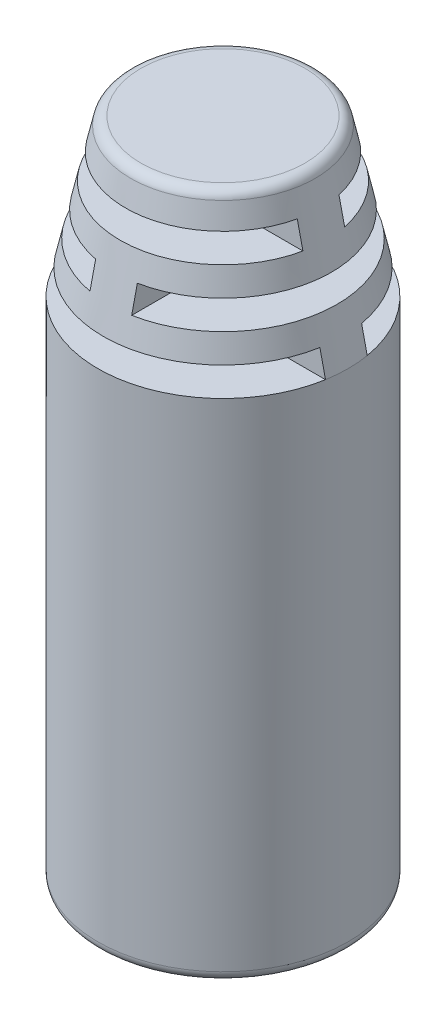
ISO-10303-21;
HEADER;
FILE_DESCRIPTION(('STEP AP214'),'2;1');
FILE_NAME('part.step','',(''),(''),'','','');
FILE_SCHEMA(('AUTOMOTIVE_DESIGN { 1 0 10303 214 1 1 1 1 }'));
ENDSEC;
DATA;
#1=APPLICATION_CONTEXT('core data for automotive mechanical design processes');
#2=APPLICATION_PROTOCOL_DEFINITION('international standard','automotive_design',2000,#1);
#3=PRODUCT_CONTEXT('',#1,'mechanical');
#4=PRODUCT('Part','Part','',(#3));
#5=PRODUCT_RELATED_PRODUCT_CATEGORY('part','',(#4));
#6=PRODUCT_DEFINITION_FORMATION('','',#4);
#7=PRODUCT_DEFINITION_CONTEXT('part definition',#1,'design');
#8=PRODUCT_DEFINITION('design','',#6,#7);
#9=PRODUCT_DEFINITION_SHAPE('','',#8);
#10=(LENGTH_UNIT() NAMED_UNIT(*) SI_UNIT(.MILLI.,.METRE.));
#11=(NAMED_UNIT(*) PLANE_ANGLE_UNIT() SI_UNIT($,.RADIAN.));
#12=(NAMED_UNIT(*) SI_UNIT($,.STERADIAN.) SOLID_ANGLE_UNIT());
#13=UNCERTAINTY_MEASURE_WITH_UNIT(LENGTH_MEASURE(1.E-05),#10,'distance_accuracy_value','');
#14=(GEOMETRIC_REPRESENTATION_CONTEXT(3) GLOBAL_UNCERTAINTY_ASSIGNED_CONTEXT((#13)) GLOBAL_UNIT_ASSIGNED_CONTEXT((#10,
#11,#12)) REPRESENTATION_CONTEXT('',''));
#15=CARTESIAN_POINT('',(0.,0.,0.));
#16=DIRECTION('',(0.,0.,1.));
#17=DIRECTION('',(1.,0.,0.));
#18=AXIS2_PLACEMENT_3D('',#15,#16,#17);
#19=CARTESIAN_POINT('',(0.,-159.084,200.));
#20=DIRECTION('',(0.,1.,0.));
#21=DIRECTION('',(-1.,0.,0.));
#22=AXIS2_PLACEMENT_3D('',#19,#20,#21);
#23=CYLINDRICAL_SURFACE('',#22,4.7);
#24=CARTESIAN_POINT('',(0.,-168.684,200.));
#25=DIRECTION('',(0.,-1.,0.));
#26=DIRECTION('',(0.,0.,1.));
#27=AXIS2_PLACEMENT_3D('',#24,#25,#26);
#28=CIRCLE('',#27,4.7);
#29=CARTESIAN_POINT('',(0.,-168.684,204.7));
#30=VERTEX_POINT('',#29);
#31=EDGE_CURVE('E403',#30,#30,#28,.F.);
#32=ORIENTED_EDGE('',*,*,#31,.F.);
#33=EDGE_LOOP('',(#32));
#34=FACE_BOUND('',#33,.T.);
#35=CARTESIAN_POINT('',(0.,-164.684,200.));
#36=DIRECTION('',(0.,1.,0.));
#37=DIRECTION('',(0.,0.,-1.));
#38=AXIS2_PLACEMENT_3D('',#35,#36,#37);
#39=CIRCLE('',#38,4.7);
#40=CARTESIAN_POINT('',(0.,-164.684,195.3));
#41=VERTEX_POINT('',#40);
#42=EDGE_CURVE('E406',#41,#41,#39,.F.);
#43=ORIENTED_EDGE('',*,*,#42,.F.);
#44=EDGE_LOOP('',(#43));
#45=FACE_BOUND('',#44,.T.);
#46=ADVANCED_FACE('F41',(#34,#45),#23,.F.);
#47=CARTESIAN_POINT('',(0.,-173.684,200.));
#48=DIRECTION('',(0.,-1.,0.));
#49=DIRECTION('',(0.,0.,1.));
#50=AXIS2_PLACEMENT_3D('',#47,#48,#49);
#51=CIRCLE('',#50,4.7);
#52=CARTESIAN_POINT('',(0.,-173.684,204.7));
#53=VERTEX_POINT('',#52);
#54=EDGE_CURVE('E396',#53,#53,#51,.F.);
#55=ORIENTED_EDGE('',*,*,#54,.F.);
#56=EDGE_LOOP('',(#55));
#57=FACE_BOUND('',#56,.T.);
#58=CARTESIAN_POINT('',(0.,-169.684,200.));
#59=DIRECTION('',(0.,1.,0.));
#60=DIRECTION('',(0.,0.,-1.));
#61=AXIS2_PLACEMENT_3D('',#58,#59,#60);
#62=CIRCLE('',#61,4.7);
#63=CARTESIAN_POINT('',(0.,-169.684,195.3));
#64=VERTEX_POINT('',#63);
#65=EDGE_CURVE('E399',#64,#64,#62,.F.);
#66=ORIENTED_EDGE('',*,*,#65,.F.);
#67=EDGE_LOOP('',(#66));
#68=FACE_BOUND('',#67,.T.);
#69=ADVANCED_FACE('F417',(#57,#68),#23,.F.);
#70=CARTESIAN_POINT('',(0.,-174.184,200.));
#71=DIRECTION('',(0.,-1.,0.));
#72=DIRECTION('',(0.,0.,1.));
#73=AXIS2_PLACEMENT_3D('',#70,#71,#72);
#74=TOROIDAL_SURFACE('',#73,4.7,0.500000000000001);
#75=CARTESIAN_POINT('',(0.,-174.684,200.));
#76=DIRECTION('',(0.,1.,0.));
#77=DIRECTION('',(0.,0.,-1.));
#78=AXIS2_PLACEMENT_3D('',#75,#76,#77);
#79=CIRCLE('',#78,4.7);
#80=CARTESIAN_POINT('',(0.,-174.684,195.3));
#81=VERTEX_POINT('',#80);
#82=EDGE_CURVE('E400',#81,#81,#79,.F.);
#83=ORIENTED_EDGE('',*,*,#82,.T.);
#84=EDGE_LOOP('',(#83));
#85=FACE_BOUND('',#84,.T.);
#86=ORIENTED_EDGE('',*,*,#54,.T.);
#87=EDGE_LOOP('',(#86));
#88=FACE_BOUND('',#87,.T.);
#89=ADVANCED_FACE('F425',(#85,#88),#74,.F.);
#90=CARTESIAN_POINT('',(0.,-181.684,200.));
#91=DIRECTION('',(0.,-1.,0.));
#92=DIRECTION('',(1.,0.,0.));
#93=AXIS2_PLACEMENT_3D('',#90,#91,#92);
#94=CIRCLE('',#93,4.7);
#95=CARTESIAN_POINT('',(4.7,-181.684,200.));
#96=VERTEX_POINT('',#95);
#97=EDGE_CURVE('E380',#96,#96,#94,.F.);
#98=ORIENTED_EDGE('',*,*,#97,.F.);
#99=EDGE_LOOP('',(#98));
#100=FACE_BOUND('',#99,.T.);
#101=ORIENTED_EDGE('',*,*,#82,.F.);
#102=EDGE_LOOP('',(#101));
#103=FACE_BOUND('',#102,.T.);
#104=ADVANCED_FACE('F421',(#100,#103),#23,.F.);
#105=CARTESIAN_POINT('',(0.,-169.184,200.));
#106=DIRECTION('',(0.,-1.,0.));
#107=DIRECTION('',(0.,0.,1.));
#108=AXIS2_PLACEMENT_3D('',#105,#106,#107);
#109=TOROIDAL_SURFACE('',#108,4.7,0.500000000000001);
#110=ORIENTED_EDGE('',*,*,#65,.T.);
#111=EDGE_LOOP('',(#110));
#112=FACE_BOUND('',#111,.T.);
#113=ORIENTED_EDGE('',*,*,#31,.T.);
#114=EDGE_LOOP('',(#113));
#115=FACE_BOUND('',#114,.T.);
#116=ADVANCED_FACE('F434',(#112,#115),#109,.F.);
#117=CARTESIAN_POINT('',(0.,-164.184,200.));
#118=DIRECTION('',(0.,-1.,0.));
#119=DIRECTION('',(0.,0.,1.));
#120=AXIS2_PLACEMENT_3D('',#117,#118,#119);
#121=TOROIDAL_SURFACE('',#120,4.7,0.500000000000001);
#122=ORIENTED_EDGE('',*,*,#42,.T.);
#123=EDGE_LOOP('',(#122));
#124=FACE_BOUND('',#123,.T.);
#125=CARTESIAN_POINT('',(0.,-163.684,200.));
#126=DIRECTION('',(0.,-1.,0.));
#127=DIRECTION('',(0.,0.,1.));
#128=AXIS2_PLACEMENT_3D('',#125,#126,#127);
#129=CIRCLE('',#128,4.7);
#130=CARTESIAN_POINT('',(0.,-163.684,204.7));
#131=VERTEX_POINT('',#130);
#132=EDGE_CURVE('E393',#131,#131,#129,.F.);
#133=ORIENTED_EDGE('',*,*,#132,.T.);
#134=EDGE_LOOP('',(#133));
#135=FACE_BOUND('',#134,.T.);
#136=ADVANCED_FACE('F413',(#124,#135),#121,.F.);
#137=CARTESIAN_POINT('',(-4.2,-159.084,200.));
#138=DIRECTION('',(0.,1.,0.));
#139=DIRECTION('',(-1.,0.,0.));
#140=AXIS2_PLACEMENT_3D('',#137,#138,#139);
#141=PLANE('',#140);
#142=CARTESIAN_POINT('',(0.,-159.084,200.));
#143=DIRECTION('',(0.,1.,0.));
#144=DIRECTION('',(-1.,0.,0.));
#145=AXIS2_PLACEMENT_3D('',#142,#143,#144);
#146=CIRCLE('',#145,4.19999999999999);
#147=CARTESIAN_POINT('',(-4.19999999999999,-159.084,200.));
#148=VERTEX_POINT('',#147);
#149=EDGE_CURVE('E390',#148,#148,#146,.T.);
#150=ORIENTED_EDGE('',*,*,#149,.F.);
#151=EDGE_LOOP('',(#150));
#152=FACE_BOUND('',#151,.T.);
#153=ADVANCED_FACE('F471',(#152),#141,.F.);
#154=CARTESIAN_POINT('',(0.,-159.584,200.));
#155=DIRECTION('',(0.,1.,0.));
#156=DIRECTION('',(-1.,0.,0.));
#157=AXIS2_PLACEMENT_3D('',#154,#155,#156);
#158=TOROIDAL_SURFACE('',#157,4.2,0.5);
#159=CARTESIAN_POINT('',(0.,-159.584,200.));
#160=DIRECTION('',(0.,1.,0.));
#161=DIRECTION('',(-1.,0.,0.));
#162=AXIS2_PLACEMENT_3D('',#159,#160,#161);
#163=CIRCLE('',#162,4.7);
#164=CARTESIAN_POINT('',(-4.7,-159.584,200.));
#165=VERTEX_POINT('',#164);
#166=EDGE_CURVE('E387',#165,#165,#163,.T.);
#167=ORIENTED_EDGE('',*,*,#166,.F.);
#168=EDGE_LOOP('',(#167));
#169=FACE_BOUND('',#168,.T.);
#170=ORIENTED_EDGE('',*,*,#149,.T.);
#171=EDGE_LOOP('',(#170));
#172=FACE_BOUND('',#171,.T.);
#173=ADVANCED_FACE('F431',(#169,#172),#158,.F.);
#174=ORIENTED_EDGE('',*,*,#166,.T.);
#175=EDGE_LOOP('',(#174));
#176=FACE_BOUND('',#175,.T.);
#177=ORIENTED_EDGE('',*,*,#132,.F.);
#178=EDGE_LOOP('',(#177));
#179=FACE_BOUND('',#178,.T.);
#180=ADVANCED_FACE('F420',(#176,#179),#23,.F.);
#181=CARTESIAN_POINT('',(0.,-182.319,200.));
#182=DIRECTION('',(0.,1.,0.));
#183=DIRECTION('',(-1.,0.,0.));
#184=AXIS2_PLACEMENT_3D('',#181,#182,#183);
#185=CONICAL_SURFACE('',#184,4.84999999999999,0.78539816339745);
#186=CARTESIAN_POINT('',(0.,-182.7,200.));
#187=DIRECTION('',(0.,1.,0.));
#188=DIRECTION('',(-1.,0.,0.));
#189=AXIS2_PLACEMENT_3D('',#186,#187,#188);
#190=CIRCLE('',#189,4.46899999999999);
#191=CARTESIAN_POINT('',(-4.46899999999999,-182.7,200.));
#192=VERTEX_POINT('',#191);
#193=EDGE_CURVE('E384',#192,#192,#190,.F.);
#194=CARTESIAN_POINT('',(0.,-182.319,200.));
#195=DIRECTION('',(0.,1.,0.));
#196=DIRECTION('',(-1.,0.,0.));
#197=AXIS2_PLACEMENT_3D('',#194,#195,#196);
#198=CIRCLE('',#197,4.84999999999999);
#199=CARTESIAN_POINT('',(-4.84999999999998,-182.319,200.));
#200=VERTEX_POINT('',#199);
#201=EDGE_CURVE('E381',#200,#200,#198,.T.);
#202=CARTESIAN_POINT('',(-4.46899999999999,-182.7,200.));
#203=CARTESIAN_POINT('',(-4.47296874999998,-182.69603125,200.));
#204=CARTESIAN_POINT('',(-4.47693749999998,-182.6920625,200.));
#205=CARTESIAN_POINT('',(-4.48487499999998,-182.684125,200.));
#206=CARTESIAN_POINT('',(-4.48884374999998,-182.68015625,200.));
#207=CARTESIAN_POINT('',(-4.49678124999999,-182.67221875,200.));
#208=CARTESIAN_POINT('',(-4.50074999999999,-182.66825,200.));
#209=CARTESIAN_POINT('',(-4.50868749999998,-182.6603125,200.));
#210=CARTESIAN_POINT('',(-4.51265624999999,-182.65634375,200.));
#211=CARTESIAN_POINT('',(-4.52059374999998,-182.64840625,200.));
#212=CARTESIAN_POINT('',(-4.52456249999998,-182.6444375,200.));
#213=CARTESIAN_POINT('',(-4.53249999999998,-182.6365,200.));
#214=CARTESIAN_POINT('',(-4.53646874999998,-182.63253125,200.));
#215=CARTESIAN_POINT('',(-4.54440624999998,-182.62459375,200.));
#216=CARTESIAN_POINT('',(-4.54837499999998,-182.620625,200.));
#217=CARTESIAN_POINT('',(-4.55631249999998,-182.6126875,200.));
#218=CARTESIAN_POINT('',(-4.56028124999998,-182.60871875,200.));
#219=CARTESIAN_POINT('',(-4.56821874999998,-182.60078125,200.));
#220=CARTESIAN_POINT('',(-4.57218749999998,-182.5968125,200.));
#221=CARTESIAN_POINT('',(-4.58012499999998,-182.588875,200.));
#222=CARTESIAN_POINT('',(-4.58409374999998,-182.58490625,200.));
#223=CARTESIAN_POINT('',(-4.59203124999998,-182.57696875,200.));
#224=CARTESIAN_POINT('',(-4.59599999999998,-182.573,200.));
#225=CARTESIAN_POINT('',(-4.60393749999998,-182.5650625,200.));
#226=CARTESIAN_POINT('',(-4.60790624999998,-182.56109375,200.));
#227=CARTESIAN_POINT('',(-4.61584374999998,-182.55315625,200.));
#228=CARTESIAN_POINT('',(-4.61981249999998,-182.5491875,200.));
#229=CARTESIAN_POINT('',(-4.62774999999998,-182.54125,200.));
#230=CARTESIAN_POINT('',(-4.63171874999998,-182.53728125,200.));
#231=CARTESIAN_POINT('',(-4.63965624999998,-182.52934375,200.));
#232=CARTESIAN_POINT('',(-4.64362499999998,-182.525375,200.));
#233=CARTESIAN_POINT('',(-4.65156249999998,-182.5174375,200.));
#234=CARTESIAN_POINT('',(-4.65553124999998,-182.51346875,200.));
#235=CARTESIAN_POINT('',(-4.66346874999998,-182.50553125,200.));
#236=CARTESIAN_POINT('',(-4.66743749999998,-182.5015625,200.));
#237=CARTESIAN_POINT('',(-4.67537499999998,-182.493625,200.));
#238=CARTESIAN_POINT('',(-4.67934374999998,-182.48965625,200.));
#239=CARTESIAN_POINT('',(-4.68728124999998,-182.48171875,200.));
#240=CARTESIAN_POINT('',(-4.69124999999998,-182.47775,200.));
#241=CARTESIAN_POINT('',(-4.69918749999998,-182.4698125,200.));
#242=CARTESIAN_POINT('',(-4.70315624999998,-182.46584375,200.));
#243=CARTESIAN_POINT('',(-4.71109374999998,-182.45790625,200.));
#244=CARTESIAN_POINT('',(-4.71506249999998,-182.4539375,200.));
#245=CARTESIAN_POINT('',(-4.72299999999998,-182.446,200.));
#246=CARTESIAN_POINT('',(-4.72696874999998,-182.44203125,200.));
#247=CARTESIAN_POINT('',(-4.73490624999998,-182.43409375,200.));
#248=CARTESIAN_POINT('',(-4.73887499999998,-182.430125,200.));
#249=CARTESIAN_POINT('',(-4.74681249999998,-182.4221875,200.));
#250=CARTESIAN_POINT('',(-4.75078124999998,-182.41821875,200.));
#251=CARTESIAN_POINT('',(-4.75871874999998,-182.41028125,200.));
#252=CARTESIAN_POINT('',(-4.76268749999998,-182.4063125,200.));
#253=CARTESIAN_POINT('',(-4.77062499999998,-182.398375,200.));
#254=CARTESIAN_POINT('',(-4.77459374999998,-182.39440625,200.));
#255=CARTESIAN_POINT('',(-4.78253124999998,-182.38646875,200.));
#256=CARTESIAN_POINT('',(-4.78649999999998,-182.3825,200.));
#257=CARTESIAN_POINT('',(-4.79443749999998,-182.3745625,200.));
#258=CARTESIAN_POINT('',(-4.79840624999998,-182.37059375,200.));
#259=CARTESIAN_POINT('',(-4.80634374999998,-182.36265625,200.));
#260=CARTESIAN_POINT('',(-4.81031249999998,-182.3586875,200.));
#261=CARTESIAN_POINT('',(-4.81824999999998,-182.35075,200.));
#262=CARTESIAN_POINT('',(-4.82221874999998,-182.34678125,200.));
#263=CARTESIAN_POINT('',(-4.83015624999998,-182.33884375,200.));
#264=CARTESIAN_POINT('',(-4.83412499999998,-182.334875,200.));
#265=CARTESIAN_POINT('',(-4.84206249999998,-182.3269375,200.));
#266=CARTESIAN_POINT('',(-4.84603124999998,-182.32296875,200.));
#267=CARTESIAN_POINT('',(-4.84999999999998,-182.319,200.));
#268=B_SPLINE_CURVE_WITH_KNOTS('',3,(#202,#203,#204,#205,#206,#207,#208,#209,#210,#211,#212,
#213,#214,#215,#216,#217,#218,#219,#220,#221,#222,#223,#224,#225,#226,#227,#228,#229,#230,#231,
#232,#233,#234,#235,#236,#237,#238,#239,#240,#241,#242,#243,#244,#245,#246,#247,#248,#249,#250,
#251,#252,#253,#254,#255,#256,#257,#258,#259,#260,#261,#262,#263,#264,#265,#266,#267),
.UNSPECIFIED.,.F.,.F.,(4,2,2,2,2,2,2,2,2,2,2,2,2,2,2,2,2,2,2,2,2,2,2,2,2,2,2,2,2,2,2,2,4),(0.,
0.0168379802270233,0.0336759604540271,0.0505139406810308,0.0673519209080345,0.0841899011350382,
0.101027881362042,0.117865861589046,0.134703841816049,0.151541822043053,0.168379802270057,
0.185217782497061,0.202055762724064,0.218893742951068,0.235731723178072,0.252569703405075,
0.269407683632079,0.286245663859083,0.303083644086087,0.31992162431309,0.336759604540095,
0.353597584767098,0.370435564994102,0.387273545221106,0.404111525448109,0.420949505675113,
0.437787485902117,0.45462546612912,0.471463446356124,0.488301426583128,0.505139406810131,
0.521977387037135,0.538815367264159),.UNSPECIFIED.);
#269=EDGE_CURVE('BSEAM430',#192,#200,#268,.T.);
#270=ORIENTED_EDGE('',*,*,#193,.T.);
#271=ORIENTED_EDGE('',*,*,#201,.T.);
#272=ORIENTED_EDGE('',*,*,#269,.T.);
#273=ORIENTED_EDGE('',*,*,#269,.F.);
#274=EDGE_LOOP('',(#270,#272,#271,#273));
#275=FACE_BOUND('',#274,.T.);
#276=ADVANCED_FACE('F430',(#275),#185,.F.);
#277=CARTESIAN_POINT('',(0.,-133.607440202665,200.));
#278=DIRECTION('',(0.,1.,0.));
#279=DIRECTION('',(-1.,0.,0.));
#280=AXIS2_PLACEMENT_3D('',#277,#278,#279);
#281=CYLINDRICAL_SURFACE('',#280,4.84999999999999);
#282=ORIENTED_EDGE('',*,*,#201,.F.);
#283=EDGE_LOOP('',(#282));
#284=FACE_BOUND('',#283,.T.);
#285=CARTESIAN_POINT('',(0.,-181.684,200.));
#286=DIRECTION('',(0.,1.,0.));
#287=DIRECTION('',(-1.,0.,0.));
#288=AXIS2_PLACEMENT_3D('',#285,#286,#287);
#289=CIRCLE('',#288,4.84999999999999);
#290=CARTESIAN_POINT('',(-4.84999999999999,-181.684,200.));
#291=VERTEX_POINT('',#290);
#292=EDGE_CURVE('E377',#291,#291,#289,.T.);
#293=ORIENTED_EDGE('',*,*,#292,.T.);
#294=EDGE_LOOP('',(#293));
#295=FACE_BOUND('',#294,.T.);
#296=ADVANCED_FACE('F455',(#284,#295),#281,.F.);
#297=CARTESIAN_POINT('',(4.84999999999999,-181.684,200.));
#298=DIRECTION('',(0.,-1.,0.));
#299=DIRECTION('',(1.,0.,0.));
#300=AXIS2_PLACEMENT_3D('',#297,#298,#299);
#301=PLANE('',#300);
#302=ORIENTED_EDGE('',*,*,#292,.F.);
#303=EDGE_LOOP('',(#302));
#304=FACE_BOUND('',#303,.T.);
#305=ORIENTED_EDGE('',*,*,#97,.T.);
#306=EDGE_LOOP('',(#305));
#307=FACE_BOUND('',#306,.T.);
#308=ADVANCED_FACE('F453',(#304,#307),#301,.T.);
#309=CARTESIAN_POINT('',(0.,-182.7,200.));
#310=DIRECTION('',(0.,-1.,0.));
#311=DIRECTION('',(0.,0.,-1.));
#312=AXIS2_PLACEMENT_3D('',#309,#310,#311);
#313=PLANE('',#312);
#314=ORIENTED_EDGE('',*,*,#193,.F.);
#315=EDGE_LOOP('',(#314));
#316=FACE_BOUND('',#315,.T.);
#317=CARTESIAN_POINT('',(0.,-182.7,200.));
#318=DIRECTION('',(0.,-1.,0.));
#319=DIRECTION('',(0.,0.,-1.));
#320=AXIS2_PLACEMENT_3D('',#317,#318,#319);
#321=CIRCLE('',#320,5.50000000000001);
#322=CARTESIAN_POINT('',(0.,-182.7,194.5));
#323=VERTEX_POINT('',#322);
#324=EDGE_CURVE('E343',#323,#323,#321,.T.);
#325=ORIENTED_EDGE('',*,*,#324,.T.);
#326=EDGE_LOOP('',(#325));
#327=FACE_BOUND('',#326,.T.);
#328=ADVANCED_FACE('F365',(#316,#327),#313,.T.);
#329=CARTESIAN_POINT('',(0.,-150.9,200.));
#330=DIRECTION('',(0.,1.,0.));
#331=DIRECTION('',(0.,0.,1.));
#332=AXIS2_PLACEMENT_3D('',#329,#330,#331);
#333=PLANE('',#332);
#334=CARTESIAN_POINT('',(0.,-150.9,200.));
#335=DIRECTION('',(0.,1.,0.));
#336=DIRECTION('',(0.,0.,1.));
#337=AXIS2_PLACEMENT_3D('',#334,#335,#336);
#338=CIRCLE('',#337,3.93599760622804);
#339=CARTESIAN_POINT('',(0.,-150.9,203.935997606228));
#340=VERTEX_POINT('',#339);
#341=EDGE_CURVE('E337',#340,#340,#338,.T.);
#342=ORIENTED_EDGE('',*,*,#341,.T.);
#343=EDGE_LOOP('',(#342));
#344=FACE_BOUND('',#343,.T.);
#345=ADVANCED_FACE('F461',(#344),#333,.T.);
#346=CARTESIAN_POINT('',(0.,-202.3,201.));
#347=DIRECTION('',(0.,0.,1.));
#348=DIRECTION('',(1.,0.,0.));
#349=AXIS2_PLACEMENT_3D('',#346,#347,#348);
#350=PLANE('',#349);
#351=CARTESIAN_POINT('',(5.91607978311261,-158.399999999997,200.999999999992));
#352=CARTESIAN_POINT('',(5.87111112347081,-158.199993459572,200.999999999996));
#353=CARTESIAN_POINT('',(5.82612792879054,-157.999990189366,200.999999999999));
#354=CARTESIAN_POINT('',(5.73613246934226,-157.599990189343,201.000000000001));
#355=CARTESIAN_POINT('',(5.69112020457424,-157.399993459526,201.000000000001));
#356=CARTESIAN_POINT('',(5.64609340476775,-157.199999999928,201.));
#357=B_SPLINE_CURVE_WITH_KNOTS('',3,(#351,#352,#353,#354,#355,#356),.UNSPECIFIED.,.F.,.F.,(4,2,
4),(0.,0.614998506560551,1.22999701326841),.UNSPECIFIED.);
#358=CARTESIAN_POINT('',(5.91607978309962,-158.4,201.));
#359=VERTEX_POINT('',#358);
#360=CARTESIAN_POINT('',(5.64609340476825,-157.19999999993,201.));
#361=VERTEX_POINT('',#360);
#362=EDGE_CURVE('E328',#359,#361,#357,.T.);
#363=ORIENTED_EDGE('',*,*,#362,.T.);
#364=DIRECTION('',(1.,0.,0.));
#365=VECTOR('',#364,1.);
#366=CARTESIAN_POINT('',(0.6,-157.2,201.));
#367=LINE('',#366,#365);
#368=CARTESIAN_POINT('',(-5.64609340476825,-157.19999999993,201.));
#369=VERTEX_POINT('',#368);
#370=EDGE_CURVE('E324',#361,#369,#367,.F.);
#371=ORIENTED_EDGE('',*,*,#370,.T.);
#372=CARTESIAN_POINT('',(-5.64609340469626,-157.199999999944,200.999999999913));
#373=CARTESIAN_POINT('',(-5.69112020453741,-157.399993459534,200.999999999957));
#374=CARTESIAN_POINT('',(-5.73613246932925,-157.599990189346,200.999999999986));
#375=CARTESIAN_POINT('',(-5.82612792880355,-157.999990189363,201.000000000014));
#376=CARTESIAN_POINT('',(-5.87111112348602,-158.199993459569,201.000000000014));
#377=CARTESIAN_POINT('',(-5.9160797831192,-158.399999999996,201.));
#378=B_SPLINE_CURVE_WITH_KNOTS('',3,(#372,#373,#374,#375,#376,#377),.UNSPECIFIED.,.F.,.F.,(4,2,
4),(0.,0.614998506707851,1.22999701326841),.UNSPECIFIED.);
#379=CARTESIAN_POINT('',(-5.91607978309962,-158.4,201.));
#380=VERTEX_POINT('',#379);
#381=EDGE_CURVE('E327',#369,#380,#378,.T.);
#382=ORIENTED_EDGE('',*,*,#381,.T.);
#383=DIRECTION('',(1.,0.,0.));
#384=VECTOR('',#383,1.);
#385=CARTESIAN_POINT('',(-0.750000000000001,-158.4,201.));
#386=LINE('',#385,#384);
#387=EDGE_CURVE('E306',#380,#359,#386,.T.);
#388=ORIENTED_EDGE('',*,*,#387,.T.);
#389=EDGE_LOOP('',(#363,#371,#382,#388));
#390=FACE_BOUND('',#389,.T.);
#391=ADVANCED_FACE('F43',(#390),#350,.T.);
#392=CARTESIAN_POINT('',(0.6,-157.2,200.));
#393=DIRECTION('',(0.,1.,0.));
#394=DIRECTION('',(0.,0.,1.));
#395=AXIS2_PLACEMENT_3D('',#392,#393,#394);
#396=PLANE('',#395);
#397=CARTESIAN_POINT('',(0.,-157.199999999932,200.));
#398=DIRECTION('',(0.,-1.,0.));
#399=DIRECTION('',(0.,0.,-1.));
#400=AXIS2_PLACEMENT_3D('',#397,#398,#399);
#401=CIRCLE('',#400,5.73396640514864);
#402=EDGE_CURVE('E316',#369,#361,#401,.F.);
#403=ORIENTED_EDGE('',*,*,#402,.F.);
#404=ORIENTED_EDGE('',*,*,#370,.F.);
#405=EDGE_LOOP('',(#403,#404));
#406=FACE_BOUND('',#405,.T.);
#407=ADVANCED_FACE('F518',(#406),#396,.F.);
#408=CARTESIAN_POINT('',(0.6,-157.2,200.));
#409=DIRECTION('',(0.,1.,0.));
#410=DIRECTION('',(0.,0.,1.));
#411=AXIS2_PLACEMENT_3D('',#408,#409,#410);
#412=PLANE('',#411);
#413=CARTESIAN_POINT('',(0.,-157.199999999932,200.));
#414=DIRECTION('',(0.,-1.,0.));
#415=DIRECTION('',(0.,0.,-1.));
#416=AXIS2_PLACEMENT_3D('',#413,#414,#415);
#417=CIRCLE('',#416,5.73396640514864);
#418=CARTESIAN_POINT('',(5.6460934047764,-157.199999999966,199.));
#419=VERTEX_POINT('',#418);
#420=CARTESIAN_POINT('',(-5.6460934047764,-157.199999999966,199.));
#421=VERTEX_POINT('',#420);
#422=EDGE_CURVE('E321',#419,#421,#417,.F.);
#423=ORIENTED_EDGE('',*,*,#422,.F.);
#424=DIRECTION('',(-1.,0.,0.));
#425=VECTOR('',#424,1.);
#426=CARTESIAN_POINT('',(0.,-157.2,199.));
#427=LINE('',#426,#425);
#428=EDGE_CURVE('E298',#421,#419,#427,.F.);
#429=ORIENTED_EDGE('',*,*,#428,.F.);
#430=EDGE_LOOP('',(#423,#429));
#431=FACE_BOUND('',#430,.T.);
#432=ADVANCED_FACE('F525',(#431),#412,.F.);
#433=CARTESIAN_POINT('',(0.,-202.3,199.));
#434=DIRECTION('',(0.,0.,-1.));
#435=DIRECTION('',(-1.,0.,0.));
#436=AXIS2_PLACEMENT_3D('',#433,#434,#435);
#437=PLANE('',#436);
#438=CARTESIAN_POINT('',(5.91607978311746,-158.399999999988,199.));
#439=CARTESIAN_POINT('',(5.8711111234727,-158.199993459565,199.));
#440=CARTESIAN_POINT('',(5.82612792879056,-157.999990189361,199.));
#441=CARTESIAN_POINT('',(5.73613246934075,-157.599990189341,199.));
#442=CARTESIAN_POINT('',(5.69112020457307,-157.399993459526,199.));
#443=CARTESIAN_POINT('',(5.646093404768,-157.199999999929,199.));
#444=B_SPLINE_CURVE_WITH_KNOTS('',3,(#438,#439,#440,#441,#442,#443),.UNSPECIFIED.,.F.,.F.,(4,2,
4),(0.,0.614998506556011,1.22999701325932),.UNSPECIFIED.);
#445=CARTESIAN_POINT('',(5.91607978309962,-158.4,199.));
#446=VERTEX_POINT('',#445);
#447=EDGE_CURVE('E320',#446,#419,#444,.T.);
#448=ORIENTED_EDGE('',*,*,#447,.F.);
#449=DIRECTION('',(1.,0.,0.));
#450=VECTOR('',#449,1.);
#451=CARTESIAN_POINT('',(-0.750000000000001,-158.4,199.));
#452=LINE('',#451,#450);
#453=CARTESIAN_POINT('',(-5.9160797830999,-158.4,199.000000000002));
#454=VERTEX_POINT('',#453);
#455=EDGE_CURVE('E301',#446,#454,#452,.F.);
#456=ORIENTED_EDGE('',*,*,#455,.T.);
#457=CARTESIAN_POINT('',(-5.64609340473655,-157.199999999943,199.00000000004));
#458=CARTESIAN_POINT('',(-5.69112020455785,-157.399993459535,199.00000000002));
#459=CARTESIAN_POINT('',(-5.73613246933627,-157.599990189347,199.000000000007));
#460=CARTESIAN_POINT('',(-5.82612792879657,-157.999990189362,198.999999999993));
#461=CARTESIAN_POINT('',(-5.87111112347845,-158.199993459565,198.999999999993));
#462=CARTESIAN_POINT('',(-5.91607978311746,-158.399999999988,199.));
#463=B_SPLINE_CURVE_WITH_KNOTS('',3,(#457,#458,#459,#460,#461,#462),.UNSPECIFIED.,.F.,.F.,(4,2,
4),(0.,0.61499850669985,1.22999701325239),.UNSPECIFIED.);
#464=EDGE_CURVE('E307',#421,#454,#463,.T.);
#465=ORIENTED_EDGE('',*,*,#464,.F.);
#466=ORIENTED_EDGE('',*,*,#428,.T.);
#467=EDGE_LOOP('',(#448,#456,#465,#466));
#468=FACE_BOUND('',#467,.T.);
#469=ADVANCED_FACE('F363',(#468),#437,.T.);
#470=CARTESIAN_POINT('',(0.,-158.399999999858,200.));
#471=DIRECTION('',(0.,-1.,0.));
#472=DIRECTION('',(0.,0.,-1.));
#473=AXIS2_PLACEMENT_3D('',#470,#471,#472);
#474=CONICAL_SURFACE('',#473,5.99999999998885,0.218166156249131);
#475=CARTESIAN_POINT('',(0.,-151.291780193153,200.));
#476=DIRECTION('',(0.,1.,0.));
#477=DIRECTION('',(0.,0.,1.));
#478=AXIS2_PLACEMENT_3D('',#475,#476,#477);
#479=CIRCLE('',#478,4.42414560981507);
#480=CARTESIAN_POINT('',(0.,-151.291780193153,204.424145609815));
#481=VERTEX_POINT('',#480);
#482=EDGE_CURVE('E143',#481,#481,#479,.F.);
#483=ORIENTED_EDGE('',*,*,#482,.T.);
#484=EDGE_LOOP('',(#483));
#485=FACE_BOUND('',#484,.T.);
#486=CARTESIAN_POINT('',(0.,-152.399999999659,200.));
#487=DIRECTION('',(0.,-1.,0.));
#488=DIRECTION('',(0.,0.,-1.));
#489=AXIS2_PLACEMENT_3D('',#486,#487,#488);
#490=CIRCLE('',#489,4.66983202566178);
#491=CARTESIAN_POINT('',(-4.5615053598438,-152.399999999653,201.));
#492=VERTEX_POINT('',#491);
#493=CARTESIAN_POINT('',(4.5615053598438,-152.399999999653,201.));
#494=VERTEX_POINT('',#493);
#495=EDGE_CURVE('E136',#492,#494,#490,.F.);
#496=ORIENTED_EDGE('',*,*,#495,.T.);
#497=CARTESIAN_POINT('',(4.83350487963407,-153.599999999782,200.999999999675));
#498=CARTESIAN_POINT('',(4.78822578613554,-153.399987723667,200.999999999837));
#499=CARTESIAN_POINT('',(4.7429196127485,-153.199981585649,200.999999999946));
#500=CARTESIAN_POINT('',(4.65225310615134,-152.799981585604,201.000000000054));
#501=CARTESIAN_POINT('',(4.60689277294118,-152.599987723577,201.000000000054));
#502=CARTESIAN_POINT('',(4.56150535984244,-152.399999999647,201.));
#503=B_SPLINE_CURVE_WITH_KNOTS('',3,(#497,#498,#499,#500,#501,#502),.UNSPECIFIED.,.F.,.F.,(4,2,
4),(0.,0.615220238067389,1.23044047675949),.UNSPECIFIED.);
#504=CARTESIAN_POINT('',(4.83350487989737,-153.59999999974,201.));
#505=VERTEX_POINT('',#504);
#506=EDGE_CURVE('E131',#505,#494,#503,.T.);
#507=ORIENTED_EDGE('',*,*,#506,.F.);
#508=CARTESIAN_POINT('',(0.,-153.599999999756,200.));
#509=DIRECTION('',(0.,-1.,0.));
#510=DIRECTION('',(0.,0.,-1.));
#511=AXIS2_PLACEMENT_3D('',#508,#509,#510);
#512=CIRCLE('',#511,4.9358656205398);
#513=CARTESIAN_POINT('',(-4.83350487995388,-153.6,201.000000000012));
#514=VERTEX_POINT('',#513);
#515=EDGE_CURVE('E142',#505,#514,#512,.T.);
#516=ORIENTED_EDGE('',*,*,#515,.T.);
#517=CARTESIAN_POINT('',(-4.56150535952528,-152.399999999719,200.999999999598));
#518=CARTESIAN_POINT('',(-4.60689277273931,-152.599987723622,200.999999999799));
#519=CARTESIAN_POINT('',(-4.65225310605519,-152.799981585625,200.999999999933));
#520=CARTESIAN_POINT('',(-4.74291961284461,-153.199981585627,201.000000000067));
#521=CARTESIAN_POINT('',(-4.78822578631821,-153.399987723625,201.000000000067));
#522=CARTESIAN_POINT('',(-4.83350487989371,-153.599999999724,201.));
#523=B_SPLINE_CURVE_WITH_KNOTS('',3,(#517,#518,#519,#520,#521,#522),.UNSPECIFIED.,.F.,.F.,(4,2,
4),(0.,0.61522023869214,1.23044047675951),.UNSPECIFIED.);
#524=EDGE_CURVE('E57',#492,#514,#523,.T.);
#525=ORIENTED_EDGE('',*,*,#524,.F.);
#526=EDGE_LOOP('',(#496,#507,#516,#525));
#527=FACE_BOUND('',#526,.T.);
#528=CARTESIAN_POINT('',(0.,-154.799999999796,200.));
#529=DIRECTION('',(0.,-1.,0.));
#530=DIRECTION('',(0.,0.,-1.));
#531=AXIS2_PLACEMENT_3D('',#528,#529,#530);
#532=CIRCLE('',#531,5.20189921540521);
#533=CARTESIAN_POINT('',(1.,-154.799999999792,205.104875654433));
#534=VERTEX_POINT('',#533);
#535=CARTESIAN_POINT('',(1.,-154.799999999792,194.895124345567));
#536=VERTEX_POINT('',#535);
#537=EDGE_CURVE('E177',#534,#536,#532,.F.);
#538=ORIENTED_EDGE('',*,*,#537,.T.);
#539=CARTESIAN_POINT('',(0.999999999832347,-155.999999999895,194.62428709693));
#540=CARTESIAN_POINT('',(0.999999999916174,-155.799991192431,194.669387614951));
#541=CARTESIAN_POINT('',(0.999999999972058,-155.599986788714,194.714507644676));
#542=CARTESIAN_POINT('',(1.00000000002794,-155.199986788678,194.804786727555));
#543=CARTESIAN_POINT('',(1.00000000002794,-154.99999119236,194.849945780709));
#544=CARTESIAN_POINT('',(1.,-154.799999999789,194.895124345568));
#545=B_SPLINE_CURVE_WITH_KNOTS('',3,(#539,#540,#541,#542,#543,#544),.UNSPECIFIED.,.F.,.F.,(4,2,
4),(0.,0.615092031567201,1.23018406342627),.UNSPECIFIED.);
#546=CARTESIAN_POINT('',(1.,-155.999999999878,194.62428709679));
#547=VERTEX_POINT('',#546);
#548=EDGE_CURVE('E202',#547,#536,#545,.T.);
#549=ORIENTED_EDGE('',*,*,#548,.F.);
#550=CARTESIAN_POINT('',(0.,-155.999999999892,200.));
#551=DIRECTION('',(0.,-1.,0.));
#552=DIRECTION('',(0.,0.,-1.));
#553=AXIS2_PLACEMENT_3D('',#550,#551,#552);
#554=CIRCLE('',#553,5.46793281028322);
#555=CARTESIAN_POINT('',(1.00000000000494,-156.,205.375712903236));
#556=VERTEX_POINT('',#555);
#557=EDGE_CURVE('E181',#547,#556,#554,.T.);
#558=ORIENTED_EDGE('',*,*,#557,.T.);
#559=CARTESIAN_POINT('',(0.999999999752745,-154.799999999834,205.104875654233));
#560=CARTESIAN_POINT('',(0.999999999876373,-154.999991192388,205.150054219168));
#561=CARTESIAN_POINT('',(0.999999999958791,-155.199986788691,205.195213272389));
#562=CARTESIAN_POINT('',(1.00000000004121,-155.599986788701,205.28549235538));
#563=CARTESIAN_POINT('',(1.00000000004121,-155.799991192408,205.330612385151));
#564=CARTESIAN_POINT('',(1.,-155.999999999864,205.375712903207));
#565=B_SPLINE_CURVE_WITH_KNOTS('',3,(#559,#560,#561,#562,#563,#564),.UNSPECIFIED.,.F.,.F.,(4,2,
4),(0.,0.615092031859095,1.23018406342626),.UNSPECIFIED.);
#566=EDGE_CURVE('E182',#534,#556,#565,.T.);
#567=ORIENTED_EDGE('',*,*,#566,.F.);
#568=EDGE_LOOP('',(#538,#549,#558,#567));
#569=FACE_BOUND('',#568,.T.);
#570=CARTESIAN_POINT('',(0.,-152.399999999659,200.));
#571=DIRECTION('',(0.,-1.,0.));
#572=DIRECTION('',(0.,0.,-1.));
#573=AXIS2_PLACEMENT_3D('',#570,#571,#572);
#574=CIRCLE('',#573,4.66983202566178);
#575=CARTESIAN_POINT('',(4.5615053598438,-152.399999999653,199.));
#576=VERTEX_POINT('',#575);
#577=CARTESIAN_POINT('',(-4.5615053598438,-152.399999999653,199.));
#578=VERTEX_POINT('',#577);
#579=EDGE_CURVE('E214',#576,#578,#574,.F.);
#580=ORIENTED_EDGE('',*,*,#579,.T.);
#581=CARTESIAN_POINT('',(-4.83350487963406,-153.599999999782,199.000000000325));
#582=CARTESIAN_POINT('',(-4.78822578613554,-153.399987723667,199.000000000163));
#583=CARTESIAN_POINT('',(-4.7429196127485,-153.199981585649,199.000000000054));
#584=CARTESIAN_POINT('',(-4.65225310615135,-152.799981585604,198.999999999946));
#585=CARTESIAN_POINT('',(-4.60689277294119,-152.599987723577,198.999999999946));
#586=CARTESIAN_POINT('',(-4.56150535984245,-152.399999999647,199.));
#587=B_SPLINE_CURVE_WITH_KNOTS('',3,(#581,#582,#583,#584,#585,#586),.UNSPECIFIED.,.F.,.F.,(4,2,
4),(0.,0.615220238067358,1.23044047675945),.UNSPECIFIED.);
#588=CARTESIAN_POINT('',(-4.83350487989737,-153.59999999974,199.));
#589=VERTEX_POINT('',#588);
#590=EDGE_CURVE('E239',#589,#578,#587,.T.);
#591=ORIENTED_EDGE('',*,*,#590,.F.);
#592=CARTESIAN_POINT('',(0.,-153.599999999756,200.));
#593=DIRECTION('',(0.,-1.,0.));
#594=DIRECTION('',(0.,0.,-1.));
#595=AXIS2_PLACEMENT_3D('',#592,#593,#594);
#596=CIRCLE('',#595,4.9358656205398);
#597=CARTESIAN_POINT('',(4.83350487995388,-153.6,198.999999999988));
#598=VERTEX_POINT('',#597);
#599=EDGE_CURVE('E218',#589,#598,#596,.T.);
#600=ORIENTED_EDGE('',*,*,#599,.T.);
#601=CARTESIAN_POINT('',(4.56150535952526,-152.399999999719,199.000000000402));
#602=CARTESIAN_POINT('',(4.6068927727393,-152.599987723622,199.000000000201));
#603=CARTESIAN_POINT('',(4.65225310605519,-152.799981585625,199.000000000067));
#604=CARTESIAN_POINT('',(4.74291961284462,-153.199981585627,198.999999999933));
#605=CARTESIAN_POINT('',(4.78822578631822,-153.399987723626,198.999999999933));
#606=CARTESIAN_POINT('',(4.83350487989371,-153.599999999724,199.));
#607=B_SPLINE_CURVE_WITH_KNOTS('',3,(#601,#602,#603,#604,#605,#606),.UNSPECIFIED.,.F.,.F.,(4,2,
4),(0.,0.615220238692145,1.23044047675948),.UNSPECIFIED.);
#608=EDGE_CURVE('E219',#576,#598,#607,.T.);
#609=ORIENTED_EDGE('',*,*,#608,.F.);
#610=EDGE_LOOP('',(#580,#591,#600,#609));
#611=FACE_BOUND('',#610,.T.);
#612=CARTESIAN_POINT('',(0.,-154.799999999796,200.));
#613=DIRECTION('',(0.,-1.,0.));
#614=DIRECTION('',(0.,0.,-1.));
#615=AXIS2_PLACEMENT_3D('',#612,#613,#614);
#616=CIRCLE('',#615,5.20189921540521);
#617=CARTESIAN_POINT('',(-1.,-154.799999999792,194.895124345567));
#618=VERTEX_POINT('',#617);
#619=CARTESIAN_POINT('',(-1.,-154.799999999792,205.104875654433));
#620=VERTEX_POINT('',#619);
#621=EDGE_CURVE('E251',#618,#620,#616,.F.);
#622=ORIENTED_EDGE('',*,*,#621,.T.);
#623=CARTESIAN_POINT('',(-0.999999999832321,-155.999999999895,205.37571290307));
#624=CARTESIAN_POINT('',(-0.99999999991616,-155.799991192431,205.330612385049));
#625=CARTESIAN_POINT('',(-0.999999999972053,-155.599986788714,205.285492355324));
#626=CARTESIAN_POINT('',(-1.00000000002795,-155.199986788678,205.195213272445));
#627=CARTESIAN_POINT('',(-1.00000000002795,-154.99999119236,205.150054219291));
#628=CARTESIAN_POINT('',(-1.,-154.799999999789,205.104875654433));
#629=B_SPLINE_CURVE_WITH_KNOTS('',3,(#623,#624,#625,#626,#627,#628),.UNSPECIFIED.,.F.,.F.,(4,2,
4),(0.,0.615092031567195,1.23018406342627),.UNSPECIFIED.);
#630=CARTESIAN_POINT('',(-1.,-155.999999999878,205.37571290321));
#631=VERTEX_POINT('',#630);
#632=EDGE_CURVE('E275',#631,#620,#629,.T.);
#633=ORIENTED_EDGE('',*,*,#632,.F.);
#634=CARTESIAN_POINT('',(0.,-155.999999999892,200.));
#635=DIRECTION('',(0.,-1.,0.));
#636=DIRECTION('',(0.,0.,-1.));
#637=AXIS2_PLACEMENT_3D('',#634,#635,#636);
#638=CIRCLE('',#637,5.46793281028322);
#639=CARTESIAN_POINT('',(-1.00000000000494,-156.,194.624287096764));
#640=VERTEX_POINT('',#639);
#641=EDGE_CURVE('E255',#631,#640,#638,.T.);
#642=ORIENTED_EDGE('',*,*,#641,.T.);
#643=CARTESIAN_POINT('',(-0.999999999752743,-154.799999999834,194.895124345767));
#644=CARTESIAN_POINT('',(-0.999999999876372,-154.999991192388,194.849945780832));
#645=CARTESIAN_POINT('',(-0.999999999958791,-155.199986788691,194.804786727611));
#646=CARTESIAN_POINT('',(-1.00000000004121,-155.599986788701,194.71450764462));
#647=CARTESIAN_POINT('',(-1.00000000004121,-155.799991192408,194.669387614849));
#648=CARTESIAN_POINT('',(-1.,-155.999999999864,194.624287096793));
#649=B_SPLINE_CURVE_WITH_KNOTS('',3,(#643,#644,#645,#646,#647,#648),.UNSPECIFIED.,.F.,.F.,(4,2,
4),(0.,0.615092031859095,1.23018406342626),.UNSPECIFIED.);
#650=EDGE_CURVE('E256',#618,#640,#649,.T.);
#651=ORIENTED_EDGE('',*,*,#650,.F.);
#652=EDGE_LOOP('',(#622,#633,#642,#651));
#653=FACE_BOUND('',#652,.T.);
#654=CARTESIAN_POINT('',(0.,-158.4,200.));
#655=DIRECTION('',(0.,1.,0.));
#656=DIRECTION('',(0.,0.,1.));
#657=AXIS2_PLACEMENT_3D('',#654,#655,#656);
#658=CIRCLE('',#657,6.);
#659=EDGE_CURVE('E312',#380,#454,#658,.F.);
#660=ORIENTED_EDGE('',*,*,#659,.F.);
#661=ORIENTED_EDGE('',*,*,#381,.F.);
#662=ORIENTED_EDGE('',*,*,#402,.T.);
#663=ORIENTED_EDGE('',*,*,#362,.F.);
#664=CARTESIAN_POINT('',(0.,-158.4,200.));
#665=DIRECTION('',(0.,1.,0.));
#666=DIRECTION('',(0.,0.,1.));
#667=AXIS2_PLACEMENT_3D('',#664,#665,#666);
#668=CIRCLE('',#667,6.);
#669=EDGE_CURVE('E295',#446,#359,#668,.F.);
#670=ORIENTED_EDGE('',*,*,#669,.F.);
#671=ORIENTED_EDGE('',*,*,#447,.T.);
#672=ORIENTED_EDGE('',*,*,#422,.T.);
#673=ORIENTED_EDGE('',*,*,#464,.T.);
#674=EDGE_LOOP('',(#660,#661,#662,#663,#670,#671,#672,#673));
#675=FACE_BOUND('',#674,.T.);
#676=ADVANCED_FACE('F149',(#485,#527,#569,#611,#653,#675),#474,.T.);
#677=CARTESIAN_POINT('',(0.,-158.4,200.));
#678=DIRECTION('',(0.,-1.,0.));
#679=DIRECTION('',(0.,0.,-1.));
#680=AXIS2_PLACEMENT_3D('',#677,#678,#679);
#681=PLANE('',#680);
#682=ORIENTED_EDGE('',*,*,#387,.F.);
#683=CARTESIAN_POINT('',(0.,-158.4,200.));
#684=DIRECTION('',(0.,1.,0.));
#685=DIRECTION('',(0.,0.,-1.));
#686=AXIS2_PLACEMENT_3D('',#683,#684,#685);
#687=CIRCLE('',#686,6.00000000000001);
#688=EDGE_CURVE('E290',#380,#359,#687,.T.);
#689=ORIENTED_EDGE('',*,*,#688,.T.);
#690=EDGE_LOOP('',(#682,#689));
#691=FACE_BOUND('',#690,.T.);
#692=ADVANCED_FACE('F362',(#691),#681,.F.);
#693=CARTESIAN_POINT('',(0.,-182.7,200.));
#694=DIRECTION('',(0.,1.,0.));
#695=DIRECTION('',(0.,0.,1.));
#696=AXIS2_PLACEMENT_3D('',#693,#694,#695);
#697=CYLINDRICAL_SURFACE('',#696,6.00000000000001);
#698=CARTESIAN_POINT('',(0.,-182.2,200.));
#699=DIRECTION('',(0.,-1.,0.));
#700=DIRECTION('',(0.,0.,-1.));
#701=AXIS2_PLACEMENT_3D('',#698,#699,#700);
#702=CIRCLE('',#701,6.00000000000001);
#703=CARTESIAN_POINT('',(0.,-182.2,194.));
#704=VERTEX_POINT('',#703);
#705=EDGE_CURVE('E315',#704,#704,#702,.F.);
#706=ORIENTED_EDGE('',*,*,#705,.T.);
#707=EDGE_LOOP('',(#706));
#708=FACE_BOUND('',#707,.T.);
#709=ORIENTED_EDGE('',*,*,#659,.T.);
#710=EDGE_CURVE('E281',#446,#454,#687,.T.);
#711=ORIENTED_EDGE('',*,*,#710,.F.);
#712=ORIENTED_EDGE('',*,*,#669,.T.);
#713=ORIENTED_EDGE('',*,*,#688,.F.);
#714=EDGE_LOOP('',(#709,#711,#712,#713));
#715=FACE_BOUND('',#714,.T.);
#716=ADVANCED_FACE('F554',(#708,#715),#697,.T.);
#717=ORIENTED_EDGE('',*,*,#455,.F.);
#718=ORIENTED_EDGE('',*,*,#710,.T.);
#719=EDGE_LOOP('',(#717,#718));
#720=FACE_BOUND('',#719,.T.);
#721=ADVANCED_FACE('F271',(#720),#681,.F.);
#722=CARTESIAN_POINT('',(0.,-154.8,199.4));
#723=DIRECTION('',(0.,1.,0.));
#724=DIRECTION('',(0.,0.,1.));
#725=AXIS2_PLACEMENT_3D('',#722,#723,#724);
#726=PLANE('',#725);
#727=ORIENTED_EDGE('',*,*,#621,.F.);
#728=DIRECTION('',(0.,0.,1.));
#729=VECTOR('',#728,1.);
#730=CARTESIAN_POINT('',(-1.,-154.8,199.4));
#731=LINE('',#730,#729);
#732=EDGE_CURVE('E264',#620,#618,#731,.F.);
#733=ORIENTED_EDGE('',*,*,#732,.F.);
#734=EDGE_LOOP('',(#727,#733));
#735=FACE_BOUND('',#734,.T.);
#736=ADVANCED_FACE('F235',(#735),#726,.F.);
#737=CARTESIAN_POINT('',(-1.,-199.9,200.));
#738=DIRECTION('',(-1.,0.,0.));
#739=DIRECTION('',(0.,0.,1.));
#740=AXIS2_PLACEMENT_3D('',#737,#738,#739);
#741=PLANE('',#740);
#742=ORIENTED_EDGE('',*,*,#632,.T.);
#743=ORIENTED_EDGE('',*,*,#732,.T.);
#744=ORIENTED_EDGE('',*,*,#650,.T.);
#745=DIRECTION('',(0.,0.,-1.));
#746=VECTOR('',#745,1.);
#747=CARTESIAN_POINT('',(-1.,-156.,199.4));
#748=LINE('',#747,#746);
#749=EDGE_CURVE('E228',#640,#631,#748,.F.);
#750=ORIENTED_EDGE('',*,*,#749,.T.);
#751=EDGE_LOOP('',(#742,#743,#744,#750));
#752=FACE_BOUND('',#751,.T.);
#753=ADVANCED_FACE('F266',(#752),#741,.T.);
#754=CARTESIAN_POINT('',(0.,-156.,199.4));
#755=DIRECTION('',(0.,-1.,0.));
#756=DIRECTION('',(0.,0.,-1.));
#757=AXIS2_PLACEMENT_3D('',#754,#755,#756);
#758=PLANE('',#757);
#759=ORIENTED_EDGE('',*,*,#641,.F.);
#760=ORIENTED_EDGE('',*,*,#749,.F.);
#761=EDGE_LOOP('',(#759,#760));
#762=FACE_BOUND('',#761,.T.);
#763=ADVANCED_FACE('F273',(#762),#758,.F.);
#764=CARTESIAN_POINT('',(0.6,-152.4,200.));
#765=DIRECTION('',(0.,1.,0.));
#766=DIRECTION('',(0.,0.,1.));
#767=AXIS2_PLACEMENT_3D('',#764,#765,#766);
#768=PLANE('',#767);
#769=ORIENTED_EDGE('',*,*,#579,.F.);
#770=DIRECTION('',(1.,0.,0.));
#771=VECTOR('',#770,1.);
#772=CARTESIAN_POINT('',(0.6,-152.4,199.));
#773=LINE('',#772,#771);
#774=EDGE_CURVE('E191',#578,#576,#773,.T.);
#775=ORIENTED_EDGE('',*,*,#774,.F.);
#776=EDGE_LOOP('',(#769,#775));
#777=FACE_BOUND('',#776,.T.);
#778=ADVANCED_FACE('F198',(#777),#768,.F.);
#779=CARTESIAN_POINT('',(0.,-197.5,199.));
#780=DIRECTION('',(0.,0.,-1.));
#781=DIRECTION('',(-1.,0.,0.));
#782=AXIS2_PLACEMENT_3D('',#779,#780,#781);
#783=PLANE('',#782);
#784=ORIENTED_EDGE('',*,*,#608,.T.);
#785=DIRECTION('',(1.,0.,0.));
#786=VECTOR('',#785,1.);
#787=CARTESIAN_POINT('',(0.6,-153.6,199.));
#788=LINE('',#787,#786);
#789=EDGE_CURVE('E227',#598,#589,#788,.F.);
#790=ORIENTED_EDGE('',*,*,#789,.T.);
#791=ORIENTED_EDGE('',*,*,#590,.T.);
#792=ORIENTED_EDGE('',*,*,#774,.T.);
#793=EDGE_LOOP('',(#784,#790,#791,#792));
#794=FACE_BOUND('',#793,.T.);
#795=ADVANCED_FACE('F230',(#794),#783,.T.);
#796=CARTESIAN_POINT('',(0.6,-153.6,200.));
#797=DIRECTION('',(0.,-1.,0.));
#798=DIRECTION('',(0.,0.,-1.));
#799=AXIS2_PLACEMENT_3D('',#796,#797,#798);
#800=PLANE('',#799);
#801=ORIENTED_EDGE('',*,*,#599,.F.);
#802=ORIENTED_EDGE('',*,*,#789,.F.);
#803=EDGE_LOOP('',(#801,#802));
#804=FACE_BOUND('',#803,.T.);
#805=ADVANCED_FACE('F237',(#804),#800,.F.);
#806=CARTESIAN_POINT('',(0.,-154.8,199.4));
#807=DIRECTION('',(0.,1.,0.));
#808=DIRECTION('',(0.,0.,1.));
#809=AXIS2_PLACEMENT_3D('',#806,#807,#808);
#810=PLANE('',#809);
#811=DIRECTION('',(0.,0.,1.));
#812=VECTOR('',#811,1.);
#813=CARTESIAN_POINT('',(1.,-154.8,199.4));
#814=LINE('',#813,#812);
#815=EDGE_CURVE('E175',#536,#534,#814,.T.);
#816=ORIENTED_EDGE('',*,*,#815,.F.);
#817=ORIENTED_EDGE('',*,*,#537,.F.);
#818=EDGE_LOOP('',(#816,#817));
#819=FACE_BOUND('',#818,.T.);
#820=ADVANCED_FACE('F167',(#819),#810,.F.);
#821=CARTESIAN_POINT('',(1.,-199.9,200.));
#822=DIRECTION('',(1.,0.,0.));
#823=DIRECTION('',(0.,0.,-1.));
#824=AXIS2_PLACEMENT_3D('',#821,#822,#823);
#825=PLANE('',#824);
#826=ORIENTED_EDGE('',*,*,#566,.T.);
#827=DIRECTION('',(0.,0.,-1.));
#828=VECTOR('',#827,1.);
#829=CARTESIAN_POINT('',(1.,-156.,199.4));
#830=LINE('',#829,#828);
#831=EDGE_CURVE('E190',#556,#547,#830,.T.);
#832=ORIENTED_EDGE('',*,*,#831,.T.);
#833=ORIENTED_EDGE('',*,*,#548,.T.);
#834=ORIENTED_EDGE('',*,*,#815,.T.);
#835=EDGE_LOOP('',(#826,#832,#833,#834));
#836=FACE_BOUND('',#835,.T.);
#837=ADVANCED_FACE('F193',(#836),#825,.T.);
#838=CARTESIAN_POINT('',(0.,-156.,199.4));
#839=DIRECTION('',(0.,-1.,0.));
#840=DIRECTION('',(0.,0.,-1.));
#841=AXIS2_PLACEMENT_3D('',#838,#839,#840);
#842=PLANE('',#841);
#843=ORIENTED_EDGE('',*,*,#557,.F.);
#844=ORIENTED_EDGE('',*,*,#831,.F.);
#845=EDGE_LOOP('',(#843,#844));
#846=FACE_BOUND('',#845,.T.);
#847=ADVANCED_FACE('F200',(#846),#842,.F.);
#848=CARTESIAN_POINT('',(0.6,-152.4,200.));
#849=DIRECTION('',(0.,1.,0.));
#850=DIRECTION('',(0.,0.,1.));
#851=AXIS2_PLACEMENT_3D('',#848,#849,#850);
#852=PLANE('',#851);
#853=ORIENTED_EDGE('',*,*,#495,.F.);
#854=DIRECTION('',(1.,0.,0.));
#855=VECTOR('',#854,1.);
#856=CARTESIAN_POINT('',(0.6,-152.4,201.));
#857=LINE('',#856,#855);
#858=EDGE_CURVE('E138',#494,#492,#857,.F.);
#859=ORIENTED_EDGE('',*,*,#858,.F.);
#860=EDGE_LOOP('',(#853,#859));
#861=FACE_BOUND('',#860,.T.);
#862=ADVANCED_FACE('F137',(#861),#852,.F.);
#863=CARTESIAN_POINT('',(0.,-197.5,201.));
#864=DIRECTION('',(0.,0.,1.));
#865=DIRECTION('',(1.,0.,0.));
#866=AXIS2_PLACEMENT_3D('',#863,#864,#865);
#867=PLANE('',#866);
#868=ORIENTED_EDGE('',*,*,#506,.T.);
#869=ORIENTED_EDGE('',*,*,#858,.T.);
#870=ORIENTED_EDGE('',*,*,#524,.T.);
#871=DIRECTION('',(1.,0.,0.));
#872=VECTOR('',#871,1.);
#873=CARTESIAN_POINT('',(0.6,-153.6,201.));
#874=LINE('',#873,#872);
#875=EDGE_CURVE('E11',#514,#505,#874,.T.);
#876=ORIENTED_EDGE('',*,*,#875,.T.);
#877=EDGE_LOOP('',(#868,#869,#870,#876));
#878=FACE_BOUND('',#877,.T.);
#879=ADVANCED_FACE('F145',(#878),#867,.T.);
#880=CARTESIAN_POINT('',(0.6,-153.6,200.));
#881=DIRECTION('',(0.,-1.,0.));
#882=DIRECTION('',(0.,0.,-1.));
#883=AXIS2_PLACEMENT_3D('',#880,#881,#882);
#884=PLANE('',#883);
#885=ORIENTED_EDGE('',*,*,#515,.F.);
#886=ORIENTED_EDGE('',*,*,#875,.F.);
#887=EDGE_LOOP('',(#885,#886));
#888=FACE_BOUND('',#887,.T.);
#889=ADVANCED_FACE('F169',(#888),#884,.F.);
#890=CARTESIAN_POINT('',(0.,-182.2,200.));
#891=DIRECTION('',(0.,-1.,0.));
#892=DIRECTION('',(0.,0.,-1.));
#893=AXIS2_PLACEMENT_3D('',#890,#891,#892);
#894=TOROIDAL_SURFACE('',#893,5.50000000000001,0.499999999999994);
#895=ORIENTED_EDGE('',*,*,#324,.F.);
#896=EDGE_LOOP('',(#895));
#897=FACE_BOUND('',#896,.T.);
#898=ORIENTED_EDGE('',*,*,#705,.F.);
#899=EDGE_LOOP('',(#898));
#900=FACE_BOUND('',#899,.T.);
#901=ADVANCED_FACE('F639',(#897,#900),#894,.T.);
#902=CARTESIAN_POINT('',(0.,-151.4,200.));
#903=DIRECTION('',(0.,1.,0.));
#904=DIRECTION('',(0.,0.,1.));
#905=AXIS2_PLACEMENT_3D('',#902,#903,#904);
#906=TOROIDAL_SURFACE('',#905,3.93599760622804,0.499999999999994);
#907=ORIENTED_EDGE('',*,*,#341,.F.);
#908=EDGE_LOOP('',(#907));
#909=FACE_BOUND('',#908,.T.);
#910=ORIENTED_EDGE('',*,*,#482,.F.);
#911=EDGE_LOOP('',(#910));
#912=FACE_BOUND('',#911,.T.);
#913=ADVANCED_FACE('F658',(#909,#912),#906,.T.);
#914=CLOSED_SHELL('',(#46,#69,#89,#104,#116,#136,#153,#173,#180,#276,#296,#308,#328,#345,#391,
#407,#432,#469,#676,#692,#716,#721,#736,#753,#763,#778,#795,#805,#820,#837,#847,#862,#879,#889,
#901,#913));
#915=MANIFOLD_SOLID_BREP('B2',#914);
#916=ADVANCED_BREP_SHAPE_REPRESENTATION('',(#18,#915),#14);
#917=SHAPE_DEFINITION_REPRESENTATION(#9,#916);
ENDSEC;
END-ISO-10303-21;
